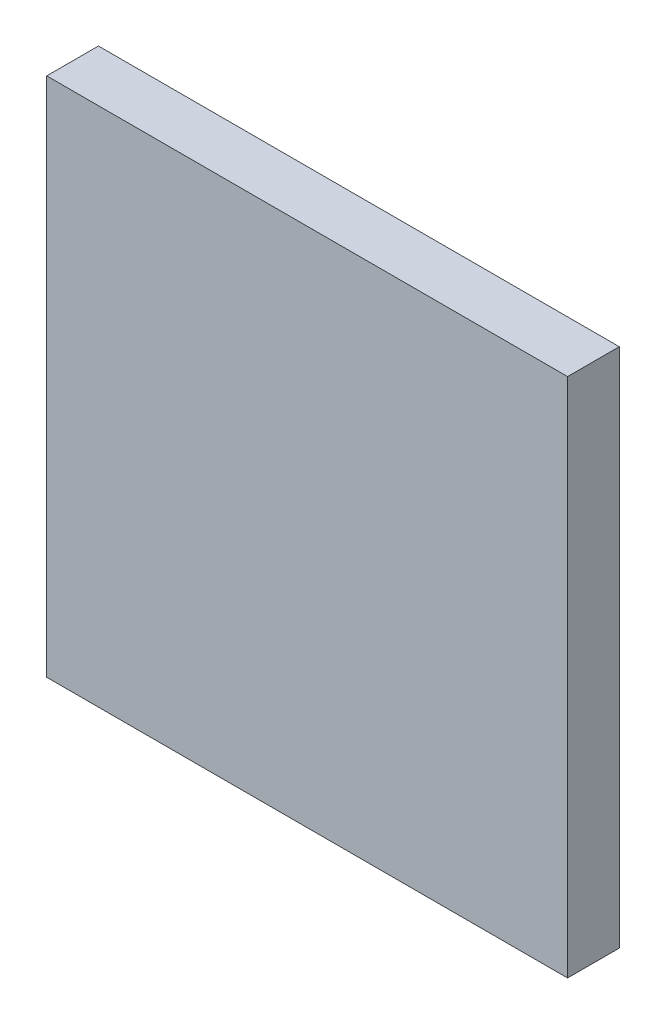
ISO-10303-21;
HEADER;
FILE_DESCRIPTION(('STEP AP214'),'2;1');
FILE_NAME('part.step','',(''),(''),'','','');
FILE_SCHEMA(('AUTOMOTIVE_DESIGN { 1 0 10303 214 1 1 1 1 }'));
ENDSEC;
DATA;
#1=APPLICATION_CONTEXT('core data for automotive mechanical design processes');
#2=APPLICATION_PROTOCOL_DEFINITION('international standard','automotive_design',2000,#1);
#3=PRODUCT_CONTEXT('',#1,'mechanical');
#4=PRODUCT('Part','Part','',(#3));
#5=PRODUCT_RELATED_PRODUCT_CATEGORY('part','',(#4));
#6=PRODUCT_DEFINITION_FORMATION('','',#4);
#7=PRODUCT_DEFINITION_CONTEXT('part definition',#1,'design');
#8=PRODUCT_DEFINITION('design','',#6,#7);
#9=PRODUCT_DEFINITION_SHAPE('','',#8);
#10=(LENGTH_UNIT() NAMED_UNIT(*) SI_UNIT(.MILLI.,.METRE.));
#11=(NAMED_UNIT(*) PLANE_ANGLE_UNIT() SI_UNIT($,.RADIAN.));
#12=(NAMED_UNIT(*) SI_UNIT($,.STERADIAN.) SOLID_ANGLE_UNIT());
#13=UNCERTAINTY_MEASURE_WITH_UNIT(LENGTH_MEASURE(1.E-05),#10,'distance_accuracy_value','');
#14=(GEOMETRIC_REPRESENTATION_CONTEXT(3) GLOBAL_UNCERTAINTY_ASSIGNED_CONTEXT((#13)) GLOBAL_UNIT_ASSIGNED_CONTEXT((#10,
#11,#12)) REPRESENTATION_CONTEXT('',''));
#15=CARTESIAN_POINT('',(0.,0.,0.));
#16=DIRECTION('',(0.,0.,1.));
#17=DIRECTION('',(1.,0.,0.));
#18=AXIS2_PLACEMENT_3D('',#15,#16,#17);
#19=CARTESIAN_POINT('',(-3.275,-3.775,0.8));
#20=DIRECTION('',(0.,0.,1.));
#21=DIRECTION('',(1.,0.,0.));
#22=AXIS2_PLACEMENT_3D('',#19,#20,#21);
#23=PLANE('',#22);
#24=DIRECTION('',(0.,1.,0.));
#25=VECTOR('',#24,1.);
#26=CARTESIAN_POINT('',(3.775,-3.775,0.8));
#27=LINE('',#26,#25);
#28=CARTESIAN_POINT('',(3.775,3.275,0.8));
#29=VERTEX_POINT('',#28);
#30=CARTESIAN_POINT('',(3.775,-3.775,0.8));
#31=VERTEX_POINT('',#30);
#32=EDGE_CURVE('E76',#29,#31,#27,.F.);
#33=ORIENTED_EDGE('',*,*,#32,.F.);
#34=DIRECTION('',(1.,0.,0.));
#35=VECTOR('',#34,1.);
#36=CARTESIAN_POINT('',(-3.275,3.275,0.8));
#37=LINE('',#36,#35);
#38=CARTESIAN_POINT('',(-3.275,3.275,0.8));
#39=VERTEX_POINT('',#38);
#40=EDGE_CURVE('E58',#39,#29,#37,.T.);
#41=ORIENTED_EDGE('',*,*,#40,.F.);
#42=DIRECTION('',(0.,1.,0.));
#43=VECTOR('',#42,1.);
#44=CARTESIAN_POINT('',(-3.275,-3.775,0.8));
#45=LINE('',#44,#43);
#46=CARTESIAN_POINT('',(-3.275,-3.775,0.8));
#47=VERTEX_POINT('',#46);
#48=EDGE_CURVE('E20',#39,#47,#45,.F.);
#49=ORIENTED_EDGE('',*,*,#48,.T.);
#50=DIRECTION('',(1.,0.,0.));
#51=VECTOR('',#50,1.);
#52=CARTESIAN_POINT('',(-3.275,-3.775,0.8));
#53=LINE('',#52,#51);
#54=EDGE_CURVE('E55',#47,#31,#53,.T.);
#55=ORIENTED_EDGE('',*,*,#54,.T.);
#56=EDGE_LOOP('',(#33,#41,#49,#55));
#57=FACE_BOUND('',#56,.T.);
#58=ADVANCED_FACE('F17',(#57),#23,.T.);
#59=CARTESIAN_POINT('',(-3.275,-3.775,0.1));
#60=DIRECTION('',(1.,0.,0.));
#61=DIRECTION('',(0.,0.,-1.));
#62=AXIS2_PLACEMENT_3D('',#59,#60,#61);
#63=PLANE('',#62);
#64=DIRECTION('',(0.,0.,1.));
#65=VECTOR('',#64,1.);
#66=CARTESIAN_POINT('',(-3.275,3.275,0.1));
#67=LINE('',#66,#65);
#68=CARTESIAN_POINT('',(-3.275,3.275,0.1));
#69=VERTEX_POINT('',#68);
#70=EDGE_CURVE('E78',#69,#39,#67,.T.);
#71=ORIENTED_EDGE('',*,*,#70,.F.);
#72=DIRECTION('',(0.,1.,0.));
#73=VECTOR('',#72,1.);
#74=CARTESIAN_POINT('',(-3.275,-3.775,0.1));
#75=LINE('',#74,#73);
#76=CARTESIAN_POINT('',(-3.275,-3.775,0.1));
#77=VERTEX_POINT('',#76);
#78=EDGE_CURVE('E73',#69,#77,#75,.F.);
#79=ORIENTED_EDGE('',*,*,#78,.T.);
#80=DIRECTION('',(0.,0.,1.));
#81=VECTOR('',#80,1.);
#82=CARTESIAN_POINT('',(-3.275,-3.775,0.1));
#83=LINE('',#82,#81);
#84=EDGE_CURVE('E63',#77,#47,#83,.T.);
#85=ORIENTED_EDGE('',*,*,#84,.T.);
#86=ORIENTED_EDGE('',*,*,#48,.F.);
#87=EDGE_LOOP('',(#71,#79,#85,#86));
#88=FACE_BOUND('',#87,.T.);
#89=ADVANCED_FACE('F72',(#88),#63,.F.);
#90=CARTESIAN_POINT('',(-3.275,-3.775,0.1));
#91=DIRECTION('',(0.,1.,0.));
#92=DIRECTION('',(0.,0.,1.));
#93=AXIS2_PLACEMENT_3D('',#90,#91,#92);
#94=PLANE('',#93);
#95=ORIENTED_EDGE('',*,*,#54,.F.);
#96=ORIENTED_EDGE('',*,*,#84,.F.);
#97=DIRECTION('',(1.,0.,0.));
#98=VECTOR('',#97,1.);
#99=CARTESIAN_POINT('',(-3.275,-3.775,0.1));
#100=LINE('',#99,#98);
#101=CARTESIAN_POINT('',(3.775,-3.775,0.1));
#102=VERTEX_POINT('',#101);
#103=EDGE_CURVE('E83',#77,#102,#100,.T.);
#104=ORIENTED_EDGE('',*,*,#103,.T.);
#105=DIRECTION('',(0.,0.,-1.));
#106=VECTOR('',#105,1.);
#107=CARTESIAN_POINT('',(3.775,-3.775,0.1));
#108=LINE('',#107,#106);
#109=EDGE_CURVE('E69',#31,#102,#108,.T.);
#110=ORIENTED_EDGE('',*,*,#109,.F.);
#111=EDGE_LOOP('',(#95,#96,#104,#110));
#112=FACE_BOUND('',#111,.T.);
#113=ADVANCED_FACE('F66',(#112),#94,.F.);
#114=CARTESIAN_POINT('',(3.775,-3.775,0.1));
#115=DIRECTION('',(1.,0.,0.));
#116=DIRECTION('',(0.,0.,-1.));
#117=AXIS2_PLACEMENT_3D('',#114,#115,#116);
#118=PLANE('',#117);
#119=DIRECTION('',(0.,0.,1.));
#120=VECTOR('',#119,1.);
#121=CARTESIAN_POINT('',(3.775,3.275,0.1));
#122=LINE('',#121,#120);
#123=CARTESIAN_POINT('',(3.775,3.275,0.1));
#124=VERTEX_POINT('',#123);
#125=EDGE_CURVE('E34',#29,#124,#122,.F.);
#126=ORIENTED_EDGE('',*,*,#125,.F.);
#127=ORIENTED_EDGE('',*,*,#32,.T.);
#128=ORIENTED_EDGE('',*,*,#109,.T.);
#129=DIRECTION('',(0.,1.,0.));
#130=VECTOR('',#129,1.);
#131=CARTESIAN_POINT('',(3.775,-3.775,0.1));
#132=LINE('',#131,#130);
#133=EDGE_CURVE('E26',#102,#124,#132,.T.);
#134=ORIENTED_EDGE('',*,*,#133,.T.);
#135=EDGE_LOOP('',(#126,#127,#128,#134));
#136=FACE_BOUND('',#135,.T.);
#137=ADVANCED_FACE('F88',(#136),#118,.T.);
#138=CARTESIAN_POINT('',(-3.275,3.275,0.1));
#139=DIRECTION('',(0.,1.,0.));
#140=DIRECTION('',(0.,0.,1.));
#141=AXIS2_PLACEMENT_3D('',#138,#139,#140);
#142=PLANE('',#141);
#143=ORIENTED_EDGE('',*,*,#40,.T.);
#144=ORIENTED_EDGE('',*,*,#125,.T.);
#145=DIRECTION('',(1.,0.,0.));
#146=VECTOR('',#145,1.);
#147=CARTESIAN_POINT('',(-3.275,3.275,0.1));
#148=LINE('',#147,#146);
#149=EDGE_CURVE('E11',#124,#69,#148,.F.);
#150=ORIENTED_EDGE('',*,*,#149,.T.);
#151=ORIENTED_EDGE('',*,*,#70,.T.);
#152=EDGE_LOOP('',(#143,#144,#150,#151));
#153=FACE_BOUND('',#152,.T.);
#154=ADVANCED_FACE('F91',(#153),#142,.T.);
#155=CARTESIAN_POINT('',(-3.275,-3.775,0.1));
#156=DIRECTION('',(0.,0.,1.));
#157=DIRECTION('',(1.,0.,0.));
#158=AXIS2_PLACEMENT_3D('',#155,#156,#157);
#159=PLANE('',#158);
#160=ORIENTED_EDGE('',*,*,#133,.F.);
#161=ORIENTED_EDGE('',*,*,#103,.F.);
#162=ORIENTED_EDGE('',*,*,#78,.F.);
#163=ORIENTED_EDGE('',*,*,#149,.F.);
#164=EDGE_LOOP('',(#160,#161,#162,#163));
#165=FACE_BOUND('',#164,.T.);
#166=ADVANCED_FACE('F90',(#165),#159,.F.);
#167=CLOSED_SHELL('',(#58,#89,#113,#137,#154,#166));
#168=MANIFOLD_SOLID_BREP('B1',#167);
#169=ADVANCED_BREP_SHAPE_REPRESENTATION('',(#18,#168),#14);
#170=SHAPE_DEFINITION_REPRESENTATION(#9,#169);
ENDSEC;
END-ISO-10303-21;
